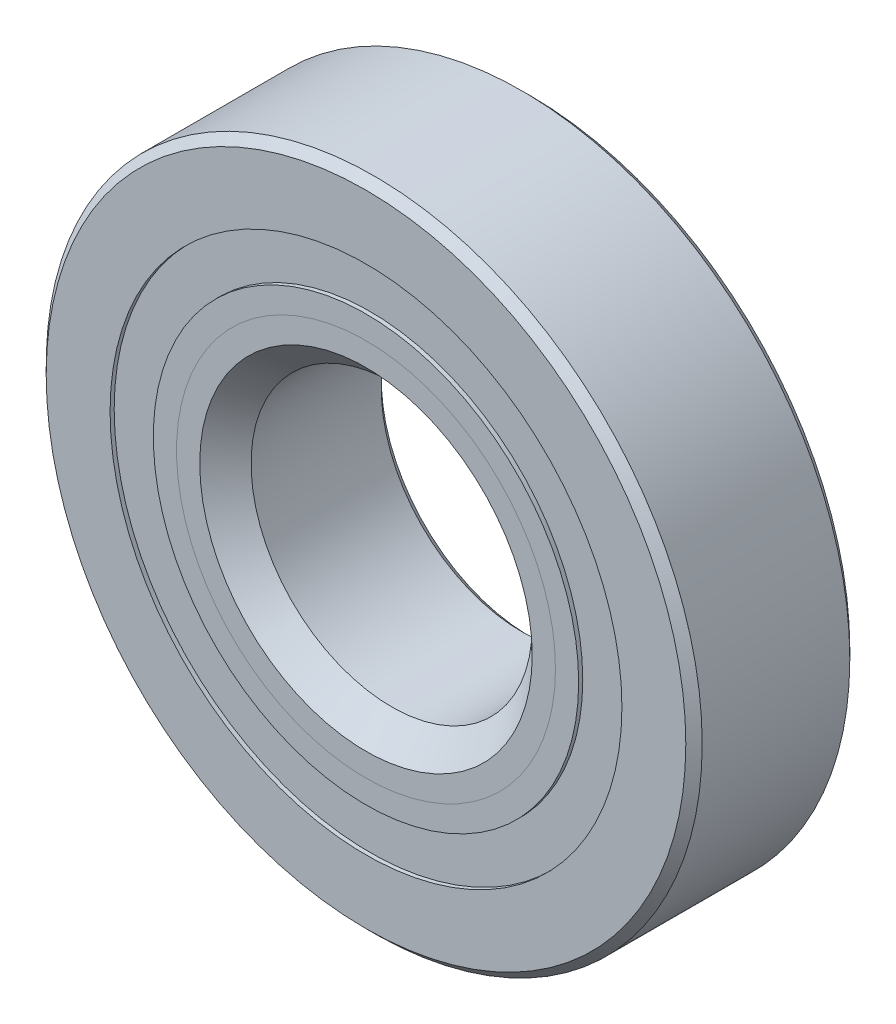
ISO-10303-21;
HEADER;
FILE_DESCRIPTION(('STEP AP214'),'2;1');
FILE_NAME('part.step','',(''),(''),'','','');
FILE_SCHEMA(('AUTOMOTIVE_DESIGN { 1 0 10303 214 1 1 1 1 }'));
ENDSEC;
DATA;
#1=APPLICATION_CONTEXT('core data for automotive mechanical design processes');
#2=APPLICATION_PROTOCOL_DEFINITION('international standard','automotive_design',2000,#1);
#3=PRODUCT_CONTEXT('',#1,'mechanical');
#4=PRODUCT('Part','Part','',(#3));
#5=PRODUCT_RELATED_PRODUCT_CATEGORY('part','',(#4));
#6=PRODUCT_DEFINITION_FORMATION('','',#4);
#7=PRODUCT_DEFINITION_CONTEXT('part definition',#1,'design');
#8=PRODUCT_DEFINITION('design','',#6,#7);
#9=PRODUCT_DEFINITION_SHAPE('','',#8);
#10=(LENGTH_UNIT() NAMED_UNIT(*) SI_UNIT(.MILLI.,.METRE.));
#11=(NAMED_UNIT(*) PLANE_ANGLE_UNIT() SI_UNIT($,.RADIAN.));
#12=(NAMED_UNIT(*) SI_UNIT($,.STERADIAN.) SOLID_ANGLE_UNIT());
#13=UNCERTAINTY_MEASURE_WITH_UNIT(LENGTH_MEASURE(1.E-05),#10,'distance_accuracy_value','');
#14=(GEOMETRIC_REPRESENTATION_CONTEXT(3) GLOBAL_UNCERTAINTY_ASSIGNED_CONTEXT((#13)) GLOBAL_UNIT_ASSIGNED_CONTEXT((#10,
#11,#12)) REPRESENTATION_CONTEXT('',''));
#15=CARTESIAN_POINT('',(0.,0.,0.));
#16=DIRECTION('',(0.,0.,1.));
#17=DIRECTION('',(1.,0.,0.));
#18=AXIS2_PLACEMENT_3D('',#15,#16,#17);
#19=CARTESIAN_POINT('',(0.,8.67019230769231,-1.43574962434292));
#20=DIRECTION('',(0.,0.,-1.));
#21=DIRECTION('',(-1.,0.,0.));
#22=AXIS2_PLACEMENT_3D('',#19,#20,#21);
#23=PLANE('',#22);
#24=CARTESIAN_POINT('',(0.,0.,-1.43574962434292));
#25=DIRECTION('',(0.,0.,1.));
#26=DIRECTION('',(1.,0.,0.));
#27=AXIS2_PLACEMENT_3D('',#24,#25,#26);
#28=CIRCLE('',#27,7.20480769230769);
#29=CARTESIAN_POINT('',(7.20480769230769,0.,-1.43574962434292));
#30=VERTEX_POINT('',#29);
#31=EDGE_CURVE('E11',#30,#30,#28,.T.);
#32=ORIENTED_EDGE('',*,*,#31,.F.);
#33=EDGE_LOOP('',(#32));
#34=FACE_BOUND('',#33,.T.);
#35=CARTESIAN_POINT('',(0.,0.,-1.43574962434292));
#36=DIRECTION('',(0.,0.,1.));
#37=DIRECTION('',(1.,0.,0.));
#38=AXIS2_PLACEMENT_3D('',#35,#36,#37);
#39=CIRCLE('',#38,8.67019230769231);
#40=CARTESIAN_POINT('',(8.67019230769231,0.,-1.43574962434292));
#41=VERTEX_POINT('',#40);
#42=EDGE_CURVE('E60',#41,#41,#39,.T.);
#43=ORIENTED_EDGE('',*,*,#42,.T.);
#44=EDGE_LOOP('',(#43));
#45=FACE_BOUND('',#44,.T.);
#46=ADVANCED_FACE('F46',(#34,#45),#23,.F.);
#47=CARTESIAN_POINT('',(0.,0.,2.77812500000001));
#48=DIRECTION('',(0.,0.,1.));
#49=DIRECTION('',(1.,0.,0.));
#50=AXIS2_PLACEMENT_3D('',#47,#48,#49);
#51=CYLINDRICAL_SURFACE('',#50,7.20480769230769);
#52=CARTESIAN_POINT('',(0.,0.,-2.63921875000001));
#53=DIRECTION('',(0.,0.,1.));
#54=DIRECTION('',(1.,0.,0.));
#55=AXIS2_PLACEMENT_3D('',#52,#53,#54);
#56=CIRCLE('',#55,7.20480769230769);
#57=CARTESIAN_POINT('',(7.20480769230769,0.,-2.63921875000001));
#58=VERTEX_POINT('',#57);
#59=EDGE_CURVE('E52',#58,#58,#56,.T.);
#60=ORIENTED_EDGE('',*,*,#59,.F.);
#61=EDGE_LOOP('',(#60));
#62=FACE_BOUND('',#61,.T.);
#63=ORIENTED_EDGE('',*,*,#31,.T.);
#64=EDGE_LOOP('',(#63));
#65=FACE_BOUND('',#64,.T.);
#66=ADVANCED_FACE('F75',(#62,#65),#51,.F.);
#67=CARTESIAN_POINT('',(0.,8.67019230769231,-2.63921874999999));
#68=DIRECTION('',(0.,0.,1.));
#69=DIRECTION('',(1.,0.,0.));
#70=AXIS2_PLACEMENT_3D('',#67,#68,#69);
#71=PLANE('',#70);
#72=CARTESIAN_POINT('',(0.,0.,-2.63921875000001));
#73=DIRECTION('',(0.,0.,1.));
#74=DIRECTION('',(1.,0.,0.));
#75=AXIS2_PLACEMENT_3D('',#72,#73,#74);
#76=CIRCLE('',#75,8.67019230769231);
#77=CARTESIAN_POINT('',(8.67019230769231,0.,-2.63921875000001));
#78=VERTEX_POINT('',#77);
#79=EDGE_CURVE('E56',#78,#78,#76,.T.);
#80=ORIENTED_EDGE('',*,*,#79,.F.);
#81=EDGE_LOOP('',(#80));
#82=FACE_BOUND('',#81,.T.);
#83=ORIENTED_EDGE('',*,*,#59,.T.);
#84=EDGE_LOOP('',(#83));
#85=FACE_BOUND('',#84,.T.);
#86=ADVANCED_FACE('F70',(#82,#85),#71,.F.);
#87=CARTESIAN_POINT('',(0.,0.,2.77812500000001));
#88=DIRECTION('',(0.,0.,1.));
#89=DIRECTION('',(1.,0.,0.));
#90=AXIS2_PLACEMENT_3D('',#87,#88,#89);
#91=CYLINDRICAL_SURFACE('',#90,8.67019230769231);
#92=ORIENTED_EDGE('',*,*,#42,.F.);
#93=EDGE_LOOP('',(#92));
#94=FACE_BOUND('',#93,.T.);
#95=ORIENTED_EDGE('',*,*,#79,.T.);
#96=EDGE_LOOP('',(#95));
#97=FACE_BOUND('',#96,.T.);
#98=ADVANCED_FACE('F67',(#94,#97),#91,.T.);
#99=CLOSED_SHELL('',(#46,#66,#86,#98));
#100=MANIFOLD_SOLID_BREP('B2',#99);
#101=CARTESIAN_POINT('',(0.,8.67019230769231,2.63921875000001));
#102=DIRECTION('',(0.,0.,-1.));
#103=DIRECTION('',(-1.,0.,0.));
#104=AXIS2_PLACEMENT_3D('',#101,#102,#103);
#105=PLANE('',#104);
#106=CARTESIAN_POINT('',(0.,0.,2.63921875000001));
#107=DIRECTION('',(0.,0.,1.));
#108=DIRECTION('',(1.,0.,0.));
#109=AXIS2_PLACEMENT_3D('',#106,#107,#108);
#110=CIRCLE('',#109,7.20480769230769);
#111=CARTESIAN_POINT('',(7.20480769230769,0.,2.63921875000001));
#112=VERTEX_POINT('',#111);
#113=EDGE_CURVE('E45',#112,#112,#110,.T.);
#114=ORIENTED_EDGE('',*,*,#113,.F.);
#115=EDGE_LOOP('',(#114));
#116=FACE_BOUND('',#115,.T.);
#117=CARTESIAN_POINT('',(0.,0.,2.63921875000001));
#118=DIRECTION('',(0.,0.,1.));
#119=DIRECTION('',(1.,0.,0.));
#120=AXIS2_PLACEMENT_3D('',#117,#118,#119);
#121=CIRCLE('',#120,8.67019230769231);
#122=CARTESIAN_POINT('',(8.67019230769231,0.,2.63921875000001));
#123=VERTEX_POINT('',#122);
#124=EDGE_CURVE('E128',#123,#123,#121,.T.);
#125=ORIENTED_EDGE('',*,*,#124,.T.);
#126=EDGE_LOOP('',(#125));
#127=FACE_BOUND('',#126,.T.);
#128=ADVANCED_FACE('F114',(#116,#127),#105,.F.);
#129=CARTESIAN_POINT('',(0.,0.,2.77812500000001));
#130=DIRECTION('',(0.,0.,1.));
#131=DIRECTION('',(1.,0.,0.));
#132=AXIS2_PLACEMENT_3D('',#129,#130,#131);
#133=CYLINDRICAL_SURFACE('',#132,7.20480769230769);
#134=CARTESIAN_POINT('',(0.,0.,1.43574962434292));
#135=DIRECTION('',(0.,0.,1.));
#136=DIRECTION('',(1.,0.,0.));
#137=AXIS2_PLACEMENT_3D('',#134,#135,#136);
#138=CIRCLE('',#137,7.20480769230769);
#139=CARTESIAN_POINT('',(7.20480769230769,0.,1.43574962434292));
#140=VERTEX_POINT('',#139);
#141=EDGE_CURVE('E120',#140,#140,#138,.T.);
#142=ORIENTED_EDGE('',*,*,#141,.F.);
#143=EDGE_LOOP('',(#142));
#144=FACE_BOUND('',#143,.T.);
#145=ORIENTED_EDGE('',*,*,#113,.T.);
#146=EDGE_LOOP('',(#145));
#147=FACE_BOUND('',#146,.T.);
#148=ADVANCED_FACE('F143',(#144,#147),#133,.F.);
#149=CARTESIAN_POINT('',(0.,8.67019230769231,1.43574962434294));
#150=DIRECTION('',(0.,0.,1.));
#151=DIRECTION('',(1.,0.,0.));
#152=AXIS2_PLACEMENT_3D('',#149,#150,#151);
#153=PLANE('',#152);
#154=CARTESIAN_POINT('',(0.,0.,1.43574962434292));
#155=DIRECTION('',(0.,0.,1.));
#156=DIRECTION('',(1.,0.,0.));
#157=AXIS2_PLACEMENT_3D('',#154,#155,#156);
#158=CIRCLE('',#157,8.67019230769231);
#159=CARTESIAN_POINT('',(8.67019230769231,0.,1.43574962434292));
#160=VERTEX_POINT('',#159);
#161=EDGE_CURVE('E124',#160,#160,#158,.T.);
#162=ORIENTED_EDGE('',*,*,#161,.F.);
#163=EDGE_LOOP('',(#162));
#164=FACE_BOUND('',#163,.T.);
#165=ORIENTED_EDGE('',*,*,#141,.T.);
#166=EDGE_LOOP('',(#165));
#167=FACE_BOUND('',#166,.T.);
#168=ADVANCED_FACE('F138',(#164,#167),#153,.F.);
#169=CARTESIAN_POINT('',(0.,0.,2.77812500000001));
#170=DIRECTION('',(0.,0.,1.));
#171=DIRECTION('',(1.,0.,0.));
#172=AXIS2_PLACEMENT_3D('',#169,#170,#171);
#173=CYLINDRICAL_SURFACE('',#172,8.67019230769231);
#174=ORIENTED_EDGE('',*,*,#124,.F.);
#175=EDGE_LOOP('',(#174));
#176=FACE_BOUND('',#175,.T.);
#177=ORIENTED_EDGE('',*,*,#161,.T.);
#178=EDGE_LOOP('',(#177));
#179=FACE_BOUND('',#178,.T.);
#180=ADVANCED_FACE('F135',(#176,#179),#173,.T.);
#181=CLOSED_SHELL('',(#128,#148,#168,#180));
#182=MANIFOLD_SOLID_BREP('B6',#181);
#183=CARTESIAN_POINT('',(-3.96874999999991,6.87407664253903,0.));
#184=DIRECTION('',(0.,0.,1.));
#185=DIRECTION('',(-0.499999999999989,0.866025403784445,0.));
#186=AXIS2_PLACEMENT_3D('',#183,#184,#185);
#187=SPHERICAL_SURFACE('',#186,1.43574962434293);
#188=CARTESIAN_POINT('',(-3.96874999999991,6.87407664253903,1.43574962434294));
#189=VERTEX_POINT('',#188);
#190=VERTEX_LOOP('',#189);
#191=FACE_BOUND('',#190,.T.);
#192=ADVANCED_FACE('F182',(#191),#187,.T.);
#193=CLOSED_SHELL('',(#192));
#194=MANIFOLD_SOLID_BREP('B40',#193);
#195=CARTESIAN_POINT('',(-6.87407664253894,3.96875000000008,0.));
#196=DIRECTION('',(0.,0.,1.));
#197=DIRECTION('',(-0.866025403784433,0.50000000000001,0.));
#198=AXIS2_PLACEMENT_3D('',#195,#196,#197);
#199=SPHERICAL_SURFACE('',#198,1.43574962434293);
#200=CARTESIAN_POINT('',(-6.87407664253894,3.96875000000008,1.43574962434293));
#201=VERTEX_POINT('',#200);
#202=VERTEX_LOOP('',#201);
#203=FACE_BOUND('',#202,.T.);
#204=ADVANCED_FACE('F214',(#203),#199,.T.);
#205=CLOSED_SHELL('',(#204));
#206=MANIFOLD_SOLID_BREP('B110',#205);
#207=CARTESIAN_POINT('',(-7.9375,0.,0.));
#208=DIRECTION('',(0.,0.,1.));
#209=DIRECTION('',(-1.,0.,0.));
#210=AXIS2_PLACEMENT_3D('',#207,#208,#209);
#211=SPHERICAL_SURFACE('',#210,1.43574962434293);
#212=CARTESIAN_POINT('',(-7.9375,0.,1.43574962434293));
#213=VERTEX_POINT('',#212);
#214=VERTEX_LOOP('',#213);
#215=FACE_BOUND('',#214,.T.);
#216=ADVANCED_FACE('F246',(#215),#211,.T.);
#217=CLOSED_SHELL('',(#216));
#218=MANIFOLD_SOLID_BREP('B178',#217);
#219=CARTESIAN_POINT('',(-6.87407664253901,-3.96874999999993,0.));
#220=DIRECTION('',(0.,0.,1.));
#221=DIRECTION('',(-0.866025403784443,-0.499999999999992,0.));
#222=AXIS2_PLACEMENT_3D('',#219,#220,#221);
#223=SPHERICAL_SURFACE('',#222,1.43574962434293);
#224=CARTESIAN_POINT('',(-6.87407664253901,-3.96874999999993,1.43574962434293));
#225=VERTEX_POINT('',#224);
#226=VERTEX_LOOP('',#225);
#227=FACE_BOUND('',#226,.T.);
#228=ADVANCED_FACE('F278',(#227),#223,.T.);
#229=CLOSED_SHELL('',(#228));
#230=MANIFOLD_SOLID_BREP('B210',#229);
#231=CARTESIAN_POINT('',(-3.96875000000006,-6.87407664253895,0.));
#232=DIRECTION('',(0.,0.,1.));
#233=DIRECTION('',(-0.500000000000007,-0.866025403784435,0.));
#234=AXIS2_PLACEMENT_3D('',#231,#232,#233);
#235=SPHERICAL_SURFACE('',#234,1.43574962434293);
#236=CARTESIAN_POINT('',(-3.96875000000006,-6.87407664253895,1.43574962434293));
#237=VERTEX_POINT('',#236);
#238=VERTEX_LOOP('',#237);
#239=FACE_BOUND('',#238,.T.);
#240=ADVANCED_FACE('F310',(#239),#235,.T.);
#241=CLOSED_SHELL('',(#240));
#242=MANIFOLD_SOLID_BREP('B242',#241);
#243=CARTESIAN_POINT('',(0.,-7.9375,0.));
#244=DIRECTION('',(0.,0.,1.));
#245=DIRECTION('',(0.,-1.,0.));
#246=AXIS2_PLACEMENT_3D('',#243,#244,#245);
#247=SPHERICAL_SURFACE('',#246,1.43574962434293);
#248=CARTESIAN_POINT('',(0.,-7.9375,1.43574962434293));
#249=VERTEX_POINT('',#248);
#250=VERTEX_LOOP('',#249);
#251=FACE_BOUND('',#250,.T.);
#252=ADVANCED_FACE('F342',(#251),#247,.T.);
#253=CLOSED_SHELL('',(#252));
#254=MANIFOLD_SOLID_BREP('B274',#253);
#255=CARTESIAN_POINT('',(3.96874999999996,-6.87407664253901,0.));
#256=DIRECTION('',(0.,0.,1.));
#257=DIRECTION('',(0.499999999999995,-0.866025403784442,0.));
#258=AXIS2_PLACEMENT_3D('',#255,#256,#257);
#259=SPHERICAL_SURFACE('',#258,1.43574962434293);
#260=CARTESIAN_POINT('',(3.96874999999996,-6.87407664253901,1.43574962434293));
#261=VERTEX_POINT('',#260);
#262=VERTEX_LOOP('',#261);
#263=FACE_BOUND('',#262,.T.);
#264=ADVANCED_FACE('F374',(#263),#259,.T.);
#265=CLOSED_SHELL('',(#264));
#266=MANIFOLD_SOLID_BREP('B306',#265);
#267=CARTESIAN_POINT('',(6.87407664253897,-3.96875000000003,0.));
#268=DIRECTION('',(0.,0.,1.));
#269=DIRECTION('',(0.866025403784436,-0.500000000000004,0.));
#270=AXIS2_PLACEMENT_3D('',#267,#268,#269);
#271=SPHERICAL_SURFACE('',#270,1.43574962434293);
#272=CARTESIAN_POINT('',(6.87407664253897,-3.96875000000003,1.43574962434293));
#273=VERTEX_POINT('',#272);
#274=VERTEX_LOOP('',#273);
#275=FACE_BOUND('',#274,.T.);
#276=ADVANCED_FACE('F406',(#275),#271,.T.);
#277=CLOSED_SHELL('',(#276));
#278=MANIFOLD_SOLID_BREP('B338',#277);
#279=CARTESIAN_POINT('',(7.9375,0.,0.));
#280=DIRECTION('',(0.,0.,1.));
#281=DIRECTION('',(1.,0.,0.));
#282=AXIS2_PLACEMENT_3D('',#279,#280,#281);
#283=SPHERICAL_SURFACE('',#282,1.43574962434293);
#284=CARTESIAN_POINT('',(7.9375,0.,1.43574962434293));
#285=VERTEX_POINT('',#284);
#286=VERTEX_LOOP('',#285);
#287=FACE_BOUND('',#286,.T.);
#288=ADVANCED_FACE('F438',(#287),#283,.T.);
#289=CLOSED_SHELL('',(#288));
#290=MANIFOLD_SOLID_BREP('B370',#289);
#291=CARTESIAN_POINT('',(6.87407664253899,3.96874999999999,0.));
#292=DIRECTION('',(0.,0.,1.));
#293=DIRECTION('',(0.86602540378444,0.499999999999998,0.));
#294=AXIS2_PLACEMENT_3D('',#291,#292,#293);
#295=SPHERICAL_SURFACE('',#294,1.43574962434293);
#296=CARTESIAN_POINT('',(6.87407664253899,3.96874999999999,1.43574962434293));
#297=VERTEX_POINT('',#296);
#298=VERTEX_LOOP('',#297);
#299=FACE_BOUND('',#298,.T.);
#300=ADVANCED_FACE('F470',(#299),#295,.T.);
#301=CLOSED_SHELL('',(#300));
#302=MANIFOLD_SOLID_BREP('B402',#301);
#303=CARTESIAN_POINT('',(3.96875000000001,6.87407664253897,0.));
#304=DIRECTION('',(0.,0.,1.));
#305=DIRECTION('',(0.500000000000001,0.866025403784438,0.));
#306=AXIS2_PLACEMENT_3D('',#303,#304,#305);
#307=SPHERICAL_SURFACE('',#306,1.43574962434293);
#308=CARTESIAN_POINT('',(3.96875000000001,6.87407664253897,1.43574962434294));
#309=VERTEX_POINT('',#308);
#310=VERTEX_LOOP('',#309);
#311=FACE_BOUND('',#310,.T.);
#312=ADVANCED_FACE('F502',(#311),#307,.T.);
#313=CLOSED_SHELL('',(#312));
#314=MANIFOLD_SOLID_BREP('B434',#313);
#315=CARTESIAN_POINT('',(0.,7.9375,0.));
#316=DIRECTION('',(0.,0.,1.));
#317=DIRECTION('',(0.,1.,0.));
#318=AXIS2_PLACEMENT_3D('',#315,#316,#317);
#319=SPHERICAL_SURFACE('',#318,1.43574962434293);
#320=CARTESIAN_POINT('',(0.,7.9375,1.43574962434293));
#321=VERTEX_POINT('',#320);
#322=VERTEX_LOOP('',#321);
#323=FACE_BOUND('',#322,.T.);
#324=ADVANCED_FACE('F536',(#323),#319,.T.);
#325=CLOSED_SHELL('',(#324));
#326=MANIFOLD_SOLID_BREP('B466',#325);
#327=CARTESIAN_POINT('',(0.,6.41846644006812,2.77812500000001));
#328=DIRECTION('',(0.,0.,-1.));
#329=DIRECTION('',(-1.,0.,0.));
#330=AXIS2_PLACEMENT_3D('',#327,#328,#329);
#331=PLANE('',#330);
#332=CARTESIAN_POINT('',(0.,0.,2.77812500000001));
#333=DIRECTION('',(0.,0.,1.));
#334=DIRECTION('',(1.,0.,0.));
#335=AXIS2_PLACEMENT_3D('',#332,#333,#334);
#336=CIRCLE('',#335,5.63212518782854);
#337=CARTESIAN_POINT('',(5.63212518782853,0.,2.77812500000001));
#338=VERTEX_POINT('',#337);
#339=EDGE_CURVE('E591',#338,#338,#336,.T.);
#340=ORIENTED_EDGE('',*,*,#339,.F.);
#341=EDGE_LOOP('',(#340));
#342=FACE_BOUND('',#341,.T.);
#343=CARTESIAN_POINT('',(0.,0.,2.77812500000001));
#344=DIRECTION('',(0.,0.,1.));
#345=DIRECTION('',(1.,0.,0.));
#346=AXIS2_PLACEMENT_3D('',#343,#344,#345);
#347=CIRCLE('',#346,6.41846644006811);
#348=CARTESIAN_POINT('',(6.41846644006811,0.,2.77812500000001));
#349=VERTEX_POINT('',#348);
#350=EDGE_CURVE('E535',#349,#349,#347,.T.);
#351=ORIENTED_EDGE('',*,*,#350,.T.);
#352=EDGE_LOOP('',(#351));
#353=FACE_BOUND('',#352,.T.);
#354=ADVANCED_FACE('F557',(#342,#353),#331,.F.);
#355=CARTESIAN_POINT('',(0.,0.,1.99178374776042));
#356=DIRECTION('',(0.,0.,1.));
#357=DIRECTION('',(1.,0.,0.));
#358=AXIS2_PLACEMENT_3D('',#355,#356,#357);
#359=CONICAL_SURFACE('',#358,5.63212518782854,0.78539816339745);
#360=ORIENTED_EDGE('',*,*,#350,.F.);
#361=EDGE_LOOP('',(#360));
#362=FACE_BOUND('',#361,.T.);
#363=CARTESIAN_POINT('',(0.,0.,1.99178374776042));
#364=DIRECTION('',(0.,0.,1.));
#365=DIRECTION('',(1.,0.,0.));
#366=AXIS2_PLACEMENT_3D('',#363,#364,#365);
#367=CIRCLE('',#366,5.63212518782854);
#368=CARTESIAN_POINT('',(5.63212518782854,0.,1.99178374776042));
#369=VERTEX_POINT('',#368);
#370=EDGE_CURVE('E563',#369,#369,#367,.T.);
#371=ORIENTED_EDGE('',*,*,#370,.T.);
#372=EDGE_LOOP('',(#371));
#373=FACE_BOUND('',#372,.T.);
#374=ADVANCED_FACE('F598',(#362,#373),#359,.T.);
#375=CARTESIAN_POINT('',(0.,0.,2.77812500000001));
#376=DIRECTION('',(0.,0.,1.));
#377=DIRECTION('',(1.,0.,0.));
#378=AXIS2_PLACEMENT_3D('',#375,#376,#377);
#379=CYLINDRICAL_SURFACE('',#378,5.63212518782854);
#380=ORIENTED_EDGE('',*,*,#370,.F.);
#381=EDGE_LOOP('',(#380));
#382=FACE_BOUND('',#381,.T.);
#383=CARTESIAN_POINT('',(0.,0.,0.));
#384=DIRECTION('',(0.,0.,1.));
#385=DIRECTION('',(1.,0.,0.));
#386=AXIS2_PLACEMENT_3D('',#383,#384,#385);
#387=CIRCLE('',#386,5.63212518782854);
#388=CARTESIAN_POINT('',(5.63212518782854,0.,0.));
#389=VERTEX_POINT('',#388);
#390=EDGE_CURVE('E567',#389,#389,#387,.T.);
#391=ORIENTED_EDGE('',*,*,#390,.T.);
#392=EDGE_LOOP('',(#391));
#393=FACE_BOUND('',#392,.T.);
#394=ADVANCED_FACE('F602',(#382,#393),#379,.T.);
#395=CARTESIAN_POINT('',(0.,5.63212518782853,0.));
#396=DIRECTION('',(0.,0.,-1.));
#397=DIRECTION('',(-1.,0.,0.));
#398=AXIS2_PLACEMENT_3D('',#395,#396,#397);
#399=PLANE('',#398);
#400=ORIENTED_EDGE('',*,*,#390,.F.);
#401=EDGE_LOOP('',(#400));
#402=FACE_BOUND('',#401,.T.);
#403=CARTESIAN_POINT('',(0.,0.,0.));
#404=DIRECTION('',(0.,0.,1.));
#405=DIRECTION('',(1.,0.,0.));
#406=AXIS2_PLACEMENT_3D('',#403,#404,#405);
#407=CIRCLE('',#406,6.50175037565707);
#408=CARTESIAN_POINT('',(6.50175037565707,0.,0.));
#409=VERTEX_POINT('',#408);
#410=EDGE_CURVE('E571',#409,#409,#407,.T.);
#411=ORIENTED_EDGE('',*,*,#410,.T.);
#412=EDGE_LOOP('',(#411));
#413=FACE_BOUND('',#412,.T.);
#414=ADVANCED_FACE('F607',(#402,#413),#399,.F.);
#415=CARTESIAN_POINT('',(0.,0.,0.));
#416=DIRECTION('',(0.,0.,1.));
#417=DIRECTION('',(1.,0.,0.));
#418=AXIS2_PLACEMENT_3D('',#415,#416,#417);
#419=TOROIDAL_SURFACE('',#418,7.9375,1.43574962434293);
#420=ORIENTED_EDGE('',*,*,#410,.F.);
#421=EDGE_LOOP('',(#420));
#422=FACE_BOUND('',#421,.T.);
#423=CARTESIAN_POINT('',(0.,0.,-1.23472222222222));
#424=DIRECTION('',(0.,0.,1.));
#425=DIRECTION('',(1.,0.,0.));
#426=AXIS2_PLACEMENT_3D('',#423,#424,#425);
#427=CIRCLE('',#426,7.20480769230769);
#428=CARTESIAN_POINT('',(7.20480769230769,0.,-1.23472222222222));
#429=VERTEX_POINT('',#428);
#430=EDGE_CURVE('E576',#429,#429,#427,.T.);
#431=ORIENTED_EDGE('',*,*,#430,.T.);
#432=EDGE_LOOP('',(#431));
#433=FACE_BOUND('',#432,.T.);
#434=ADVANCED_FACE('F613',(#422,#433),#419,.F.);
#435=CARTESIAN_POINT('',(0.,0.,2.77812500000001));
#436=DIRECTION('',(0.,0.,1.));
#437=DIRECTION('',(1.,0.,0.));
#438=AXIS2_PLACEMENT_3D('',#435,#436,#437);
#439=CYLINDRICAL_SURFACE('',#438,7.20480769230769);
#440=ORIENTED_EDGE('',*,*,#430,.F.);
#441=EDGE_LOOP('',(#440));
#442=FACE_BOUND('',#441,.T.);
#443=CARTESIAN_POINT('',(0.,0.,-2.77812500000001));
#444=DIRECTION('',(0.,0.,1.));
#445=DIRECTION('',(1.,0.,0.));
#446=AXIS2_PLACEMENT_3D('',#443,#444,#445);
#447=CIRCLE('',#446,7.20480769230769);
#448=CARTESIAN_POINT('',(7.20480769230769,0.,-2.77812500000001));
#449=VERTEX_POINT('',#448);
#450=EDGE_CURVE('E579',#449,#449,#447,.T.);
#451=ORIENTED_EDGE('',*,*,#450,.T.);
#452=EDGE_LOOP('',(#451));
#453=FACE_BOUND('',#452,.T.);
#454=ADVANCED_FACE('F617',(#442,#453),#439,.T.);
#455=CARTESIAN_POINT('',(0.,5.04031249999999,-2.77812499999999));
#456=DIRECTION('',(0.,0.,1.));
#457=DIRECTION('',(1.,0.,0.));
#458=AXIS2_PLACEMENT_3D('',#455,#456,#457);
#459=PLANE('',#458);
#460=ORIENTED_EDGE('',*,*,#450,.F.);
#461=EDGE_LOOP('',(#460));
#462=FACE_BOUND('',#461,.T.);
#463=CARTESIAN_POINT('',(0.,0.,-2.77812500000001));
#464=DIRECTION('',(0.,0.,1.));
#465=DIRECTION('',(1.,0.,0.));
#466=AXIS2_PLACEMENT_3D('',#463,#464,#465);
#467=CIRCLE('',#466,5.0403125);
#468=CARTESIAN_POINT('',(5.0403125,0.,-2.77812500000001));
#469=VERTEX_POINT('',#468);
#470=EDGE_CURVE('E582',#469,#469,#467,.T.);
#471=ORIENTED_EDGE('',*,*,#470,.T.);
#472=EDGE_LOOP('',(#471));
#473=FACE_BOUND('',#472,.T.);
#474=ADVANCED_FACE('F621',(#462,#473),#459,.F.);
#475=CARTESIAN_POINT('',(0.,0.,-2.5003125));
#476=DIRECTION('',(0.,0.,-1.));
#477=DIRECTION('',(-1.,0.,0.));
#478=AXIS2_PLACEMENT_3D('',#475,#476,#477);
#479=CONICAL_SURFACE('',#478,4.7625,0.785398163397445);
#480=ORIENTED_EDGE('',*,*,#470,.F.);
#481=EDGE_LOOP('',(#480));
#482=FACE_BOUND('',#481,.T.);
#483=CARTESIAN_POINT('',(0.,0.,-2.5003125));
#484=DIRECTION('',(0.,0.,1.));
#485=DIRECTION('',(1.,0.,0.));
#486=AXIS2_PLACEMENT_3D('',#483,#484,#485);
#487=CIRCLE('',#486,4.7625);
#488=CARTESIAN_POINT('',(4.7625,0.,-2.5003125));
#489=VERTEX_POINT('',#488);
#490=EDGE_CURVE('E585',#489,#489,#487,.T.);
#491=ORIENTED_EDGE('',*,*,#490,.T.);
#492=EDGE_LOOP('',(#491));
#493=FACE_BOUND('',#492,.T.);
#494=ADVANCED_FACE('F625',(#482,#493),#479,.F.);
#495=CARTESIAN_POINT('',(0.,0.,2.77812500000001));
#496=DIRECTION('',(0.,0.,1.));
#497=DIRECTION('',(1.,0.,0.));
#498=AXIS2_PLACEMENT_3D('',#495,#496,#497);
#499=CYLINDRICAL_SURFACE('',#498,4.7625);
#500=ORIENTED_EDGE('',*,*,#490,.F.);
#501=EDGE_LOOP('',(#500));
#502=FACE_BOUND('',#501,.T.);
#503=CARTESIAN_POINT('',(0.,0.,1.90849981217146));
#504=DIRECTION('',(0.,0.,1.));
#505=DIRECTION('',(1.,0.,0.));
#506=AXIS2_PLACEMENT_3D('',#503,#504,#505);
#507=CIRCLE('',#506,4.7625);
#508=CARTESIAN_POINT('',(4.7625,0.,1.90849981217146));
#509=VERTEX_POINT('',#508);
#510=EDGE_CURVE('E588',#509,#509,#507,.T.);
#511=ORIENTED_EDGE('',*,*,#510,.T.);
#512=EDGE_LOOP('',(#511));
#513=FACE_BOUND('',#512,.T.);
#514=ADVANCED_FACE('F629',(#502,#513),#499,.F.);
#515=CARTESIAN_POINT('',(0.,0.,2.77812500000001));
#516=DIRECTION('',(0.,0.,1.));
#517=DIRECTION('',(1.,0.,0.));
#518=AXIS2_PLACEMENT_3D('',#515,#516,#517);
#519=CONICAL_SURFACE('',#518,5.63212518782854,0.78539816339745);
#520=ORIENTED_EDGE('',*,*,#510,.F.);
#521=EDGE_LOOP('',(#520));
#522=FACE_BOUND('',#521,.T.);
#523=ORIENTED_EDGE('',*,*,#339,.T.);
#524=EDGE_LOOP('',(#523));
#525=FACE_BOUND('',#524,.T.);
#526=ADVANCED_FACE('F595',(#522,#525),#519,.F.);
#527=CLOSED_SHELL('',(#354,#374,#394,#414,#434,#454,#474,#494,#514,#526));
#528=MANIFOLD_SOLID_BREP('B498',#527);
#529=CARTESIAN_POINT('',(0.,7.20480769230769,2.77812500000001));
#530=DIRECTION('',(0.,0.,-1.));
#531=DIRECTION('',(-1.,0.,0.));
#532=AXIS2_PLACEMENT_3D('',#529,#530,#531);
#533=PLANE('',#532);
#534=CARTESIAN_POINT('',(0.,0.,2.77812500000001));
#535=DIRECTION('',(0.,0.,1.));
#536=DIRECTION('',(1.,0.,0.));
#537=AXIS2_PLACEMENT_3D('',#534,#535,#536);
#538=CIRCLE('',#537,6.41846644006811);
#539=CARTESIAN_POINT('',(6.41846644006811,0.,2.77812500000001));
#540=VERTEX_POINT('',#539);
#541=EDGE_CURVE('E556',#540,#540,#538,.T.);
#542=ORIENTED_EDGE('',*,*,#541,.F.);
#543=EDGE_LOOP('',(#542));
#544=FACE_BOUND('',#543,.T.);
#545=CARTESIAN_POINT('',(0.,0.,2.77812500000001));
#546=DIRECTION('',(0.,0.,1.));
#547=DIRECTION('',(1.,0.,0.));
#548=AXIS2_PLACEMENT_3D('',#545,#546,#547);
#549=CIRCLE('',#548,7.20480769230769);
#550=CARTESIAN_POINT('',(7.20480769230769,0.,2.77812500000001));
#551=VERTEX_POINT('',#550);
#552=EDGE_CURVE('E738',#551,#551,#549,.T.);
#553=ORIENTED_EDGE('',*,*,#552,.T.);
#554=EDGE_LOOP('',(#553));
#555=FACE_BOUND('',#554,.T.);
#556=ADVANCED_FACE('F716',(#544,#555),#533,.F.);
#557=CARTESIAN_POINT('',(0.,0.,2.77812500000001));
#558=DIRECTION('',(0.,0.,1.));
#559=DIRECTION('',(1.,0.,0.));
#560=AXIS2_PLACEMENT_3D('',#557,#558,#559);
#561=CONICAL_SURFACE('',#560,6.41846644006811,0.78539816339745);
#562=CARTESIAN_POINT('',(0.,0.,1.99178374776042));
#563=DIRECTION('',(0.,0.,1.));
#564=DIRECTION('',(1.,0.,0.));
#565=AXIS2_PLACEMENT_3D('',#562,#563,#564);
#566=CIRCLE('',#565,5.63212518782854);
#567=CARTESIAN_POINT('',(5.63212518782854,0.,1.99178374776042));
#568=VERTEX_POINT('',#567);
#569=EDGE_CURVE('E722',#568,#568,#566,.T.);
#570=ORIENTED_EDGE('',*,*,#569,.F.);
#571=EDGE_LOOP('',(#570));
#572=FACE_BOUND('',#571,.T.);
#573=ORIENTED_EDGE('',*,*,#541,.T.);
#574=EDGE_LOOP('',(#573));
#575=FACE_BOUND('',#574,.T.);
#576=ADVANCED_FACE('F763',(#572,#575),#561,.F.);
#577=CARTESIAN_POINT('',(0.,0.,2.77812500000001));
#578=DIRECTION('',(0.,0.,1.));
#579=DIRECTION('',(1.,0.,0.));
#580=AXIS2_PLACEMENT_3D('',#577,#578,#579);
#581=CYLINDRICAL_SURFACE('',#580,5.63212518782854);
#582=CARTESIAN_POINT('',(0.,0.,0.));
#583=DIRECTION('',(0.,0.,1.));
#584=DIRECTION('',(1.,0.,0.));
#585=AXIS2_PLACEMENT_3D('',#582,#583,#584);
#586=CIRCLE('',#585,5.63212518782854);
#587=CARTESIAN_POINT('',(5.63212518782854,0.,0.));
#588=VERTEX_POINT('',#587);
#589=EDGE_CURVE('E726',#588,#588,#586,.T.);
#590=ORIENTED_EDGE('',*,*,#589,.F.);
#591=EDGE_LOOP('',(#590));
#592=FACE_BOUND('',#591,.T.);
#593=ORIENTED_EDGE('',*,*,#569,.T.);
#594=EDGE_LOOP('',(#593));
#595=FACE_BOUND('',#594,.T.);
#596=ADVANCED_FACE('F758',(#592,#595),#581,.F.);
#597=CARTESIAN_POINT('',(0.,5.63212518782853,0.));
#598=DIRECTION('',(0.,0.,1.));
#599=DIRECTION('',(1.,0.,0.));
#600=AXIS2_PLACEMENT_3D('',#597,#598,#599);
#601=PLANE('',#600);
#602=CARTESIAN_POINT('',(0.,0.,0.));
#603=DIRECTION('',(0.,0.,1.));
#604=DIRECTION('',(1.,0.,0.));
#605=AXIS2_PLACEMENT_3D('',#602,#603,#604);
#606=CIRCLE('',#605,6.50175037565707);
#607=CARTESIAN_POINT('',(6.50175037565707,0.,0.));
#608=VERTEX_POINT('',#607);
#609=EDGE_CURVE('E730',#608,#608,#606,.T.);
#610=ORIENTED_EDGE('',*,*,#609,.F.);
#611=EDGE_LOOP('',(#610));
#612=FACE_BOUND('',#611,.T.);
#613=ORIENTED_EDGE('',*,*,#589,.T.);
#614=EDGE_LOOP('',(#613));
#615=FACE_BOUND('',#614,.T.);
#616=ADVANCED_FACE('F752',(#612,#615),#601,.F.);
#617=CARTESIAN_POINT('',(0.,0.,0.));
#618=DIRECTION('',(0.,0.,1.));
#619=DIRECTION('',(1.,0.,0.));
#620=AXIS2_PLACEMENT_3D('',#617,#618,#619);
#621=TOROIDAL_SURFACE('',#620,7.9375,1.43574962434293);
#622=CARTESIAN_POINT('',(0.,0.,1.23472222222222));
#623=DIRECTION('',(0.,0.,1.));
#624=DIRECTION('',(1.,0.,0.));
#625=AXIS2_PLACEMENT_3D('',#622,#623,#624);
#626=CIRCLE('',#625,7.20480769230769);
#627=CARTESIAN_POINT('',(7.20480769230769,0.,1.23472222222222));
#628=VERTEX_POINT('',#627);
#629=EDGE_CURVE('E735',#628,#628,#626,.T.);
#630=ORIENTED_EDGE('',*,*,#629,.F.);
#631=EDGE_LOOP('',(#630));
#632=FACE_BOUND('',#631,.T.);
#633=ORIENTED_EDGE('',*,*,#609,.T.);
#634=EDGE_LOOP('',(#633));
#635=FACE_BOUND('',#634,.T.);
#636=ADVANCED_FACE('F746',(#632,#635),#621,.F.);
#637=CARTESIAN_POINT('',(0.,0.,2.77812500000001));
#638=DIRECTION('',(0.,0.,1.));
#639=DIRECTION('',(1.,0.,0.));
#640=AXIS2_PLACEMENT_3D('',#637,#638,#639);
#641=CYLINDRICAL_SURFACE('',#640,7.20480769230769);
#642=ORIENTED_EDGE('',*,*,#552,.F.);
#643=EDGE_LOOP('',(#642));
#644=FACE_BOUND('',#643,.T.);
#645=ORIENTED_EDGE('',*,*,#629,.T.);
#646=EDGE_LOOP('',(#645));
#647=FACE_BOUND('',#646,.T.);
#648=ADVANCED_FACE('F743',(#644,#647),#641,.T.);
#649=CLOSED_SHELL('',(#556,#576,#596,#616,#636,#648));
#650=MANIFOLD_SOLID_BREP('B530',#649);
#651=CARTESIAN_POINT('',(0.,0.,2.5003125));
#652=DIRECTION('',(0.,0.,-1.));
#653=DIRECTION('',(-1.,0.,0.));
#654=AXIS2_PLACEMENT_3D('',#651,#652,#653);
#655=CONICAL_SURFACE('',#654,11.1125,0.785398163397446);
#656=CARTESIAN_POINT('',(0.,0.,2.77812500000001));
#657=DIRECTION('',(0.,0.,1.));
#658=DIRECTION('',(1.,0.,0.));
#659=AXIS2_PLACEMENT_3D('',#656,#657,#658);
#660=CIRCLE('',#659,10.8346875);
#661=CARTESIAN_POINT('',(10.8346875,0.,2.77812500000001));
#662=VERTEX_POINT('',#661);
#663=EDGE_CURVE('E836',#662,#662,#660,.T.);
#664=ORIENTED_EDGE('',*,*,#663,.F.);
#665=EDGE_LOOP('',(#664));
#666=FACE_BOUND('',#665,.T.);
#667=CARTESIAN_POINT('',(0.,0.,2.5003125));
#668=DIRECTION('',(0.,0.,1.));
#669=DIRECTION('',(1.,0.,0.));
#670=AXIS2_PLACEMENT_3D('',#667,#668,#669);
#671=CIRCLE('',#670,11.1125);
#672=CARTESIAN_POINT('',(11.1125,0.,2.5003125));
#673=VERTEX_POINT('',#672);
#674=EDGE_CURVE('E715',#673,#673,#671,.T.);
#675=ORIENTED_EDGE('',*,*,#674,.T.);
#676=EDGE_LOOP('',(#675));
#677=FACE_BOUND('',#676,.T.);
#678=ADVANCED_FACE('F808',(#666,#677),#655,.T.);
#679=CARTESIAN_POINT('',(0.,0.,2.77812500000001));
#680=DIRECTION('',(0.,0.,1.));
#681=DIRECTION('',(1.,0.,0.));
#682=AXIS2_PLACEMENT_3D('',#679,#680,#681);
#683=CYLINDRICAL_SURFACE('',#682,11.1125);
#684=ORIENTED_EDGE('',*,*,#674,.F.);
#685=EDGE_LOOP('',(#684));
#686=FACE_BOUND('',#685,.T.);
#687=CARTESIAN_POINT('',(0.,0.,-2.5003125));
#688=DIRECTION('',(0.,0.,1.));
#689=DIRECTION('',(1.,0.,0.));
#690=AXIS2_PLACEMENT_3D('',#687,#688,#689);
#691=CIRCLE('',#690,11.1125);
#692=CARTESIAN_POINT('',(11.1125,0.,-2.5003125));
#693=VERTEX_POINT('',#692);
#694=EDGE_CURVE('E814',#693,#693,#691,.T.);
#695=ORIENTED_EDGE('',*,*,#694,.T.);
#696=EDGE_LOOP('',(#695));
#697=FACE_BOUND('',#696,.T.);
#698=ADVANCED_FACE('F843',(#686,#697),#683,.T.);
#699=CARTESIAN_POINT('',(0.,0.,-2.77812500000001));
#700=DIRECTION('',(0.,0.,1.));
#701=DIRECTION('',(1.,0.,0.));
#702=AXIS2_PLACEMENT_3D('',#699,#700,#701);
#703=CONICAL_SURFACE('',#702,10.8346875,0.785398163397445);
#704=ORIENTED_EDGE('',*,*,#694,.F.);
#705=EDGE_LOOP('',(#704));
#706=FACE_BOUND('',#705,.T.);
#707=CARTESIAN_POINT('',(0.,0.,-2.77812500000001));
#708=DIRECTION('',(0.,0.,1.));
#709=DIRECTION('',(1.,0.,0.));
#710=AXIS2_PLACEMENT_3D('',#707,#708,#709);
#711=CIRCLE('',#710,10.8346875);
#712=CARTESIAN_POINT('',(10.8346875,0.,-2.77812500000001));
#713=VERTEX_POINT('',#712);
#714=EDGE_CURVE('E818',#713,#713,#711,.T.);
#715=ORIENTED_EDGE('',*,*,#714,.T.);
#716=EDGE_LOOP('',(#715));
#717=FACE_BOUND('',#716,.T.);
#718=ADVANCED_FACE('F847',(#706,#717),#703,.T.);
#719=CARTESIAN_POINT('',(0.,10.8346875,-2.77812499999999));
#720=DIRECTION('',(0.,0.,1.));
#721=DIRECTION('',(1.,0.,0.));
#722=AXIS2_PLACEMENT_3D('',#719,#720,#721);
#723=PLANE('',#722);
#724=ORIENTED_EDGE('',*,*,#714,.F.);
#725=EDGE_LOOP('',(#724));
#726=FACE_BOUND('',#725,.T.);
#727=CARTESIAN_POINT('',(0.,0.,-2.77812500000001));
#728=DIRECTION('',(0.,0.,1.));
#729=DIRECTION('',(1.,0.,0.));
#730=AXIS2_PLACEMENT_3D('',#727,#728,#729);
#731=CIRCLE('',#730,8.67019230769231);
#732=CARTESIAN_POINT('',(8.67019230769231,0.,-2.77812500000001));
#733=VERTEX_POINT('',#732);
#734=EDGE_CURVE('E822',#733,#733,#731,.T.);
#735=ORIENTED_EDGE('',*,*,#734,.T.);
#736=EDGE_LOOP('',(#735));
#737=FACE_BOUND('',#736,.T.);
#738=ADVANCED_FACE('F852',(#726,#737),#723,.F.);
#739=CARTESIAN_POINT('',(0.,0.,2.77812500000001));
#740=DIRECTION('',(0.,0.,1.));
#741=DIRECTION('',(1.,0.,0.));
#742=AXIS2_PLACEMENT_3D('',#739,#740,#741);
#743=CYLINDRICAL_SURFACE('',#742,8.67019230769231);
#744=ORIENTED_EDGE('',*,*,#734,.F.);
#745=EDGE_LOOP('',(#744));
#746=FACE_BOUND('',#745,.T.);
#747=CARTESIAN_POINT('',(0.,0.,-1.23472222222222));
#748=DIRECTION('',(0.,0.,1.));
#749=DIRECTION('',(1.,0.,0.));
#750=AXIS2_PLACEMENT_3D('',#747,#748,#749);
#751=CIRCLE('',#750,8.67019230769231);
#752=CARTESIAN_POINT('',(8.67019230769231,0.,-1.23472222222222));
#753=VERTEX_POINT('',#752);
#754=EDGE_CURVE('E827',#753,#753,#751,.T.);
#755=ORIENTED_EDGE('',*,*,#754,.T.);
#756=EDGE_LOOP('',(#755));
#757=FACE_BOUND('',#756,.T.);
#758=ADVANCED_FACE('F858',(#746,#757),#743,.F.);
#759=CARTESIAN_POINT('',(0.,0.,0.));
#760=DIRECTION('',(0.,0.,1.));
#761=DIRECTION('',(1.,0.,0.));
#762=AXIS2_PLACEMENT_3D('',#759,#760,#761);
#763=TOROIDAL_SURFACE('',#762,7.9375,1.43574962434293);
#764=ORIENTED_EDGE('',*,*,#754,.F.);
#765=EDGE_LOOP('',(#764));
#766=FACE_BOUND('',#765,.T.);
#767=CARTESIAN_POINT('',(0.,0.,1.23472222222222));
#768=DIRECTION('',(0.,0.,1.));
#769=DIRECTION('',(1.,0.,0.));
#770=AXIS2_PLACEMENT_3D('',#767,#768,#769);
#771=CIRCLE('',#770,8.67019230769231);
#772=CARTESIAN_POINT('',(8.67019230769231,0.,1.23472222222222));
#773=VERTEX_POINT('',#772);
#774=EDGE_CURVE('E830',#773,#773,#771,.T.);
#775=ORIENTED_EDGE('',*,*,#774,.T.);
#776=EDGE_LOOP('',(#775));
#777=FACE_BOUND('',#776,.T.);
#778=ADVANCED_FACE('F862',(#766,#777),#763,.F.);
#779=CARTESIAN_POINT('',(0.,0.,2.77812500000001));
#780=DIRECTION('',(0.,0.,1.));
#781=DIRECTION('',(1.,0.,0.));
#782=AXIS2_PLACEMENT_3D('',#779,#780,#781);
#783=CYLINDRICAL_SURFACE('',#782,8.67019230769231);
#784=ORIENTED_EDGE('',*,*,#774,.F.);
#785=EDGE_LOOP('',(#784));
#786=FACE_BOUND('',#785,.T.);
#787=CARTESIAN_POINT('',(0.,0.,2.77812500000001));
#788=DIRECTION('',(0.,0.,1.));
#789=DIRECTION('',(1.,0.,0.));
#790=AXIS2_PLACEMENT_3D('',#787,#788,#789);
#791=CIRCLE('',#790,8.67019230769231);
#792=CARTESIAN_POINT('',(8.6701923076923,0.,2.77812500000001));
#793=VERTEX_POINT('',#792);
#794=EDGE_CURVE('E833',#793,#793,#791,.T.);
#795=ORIENTED_EDGE('',*,*,#794,.T.);
#796=EDGE_LOOP('',(#795));
#797=FACE_BOUND('',#796,.T.);
#798=ADVANCED_FACE('F866',(#786,#797),#783,.F.);
#799=CARTESIAN_POINT('',(0.,10.8346875,2.77812500000001));
#800=DIRECTION('',(0.,0.,-1.));
#801=DIRECTION('',(-1.,0.,0.));
#802=AXIS2_PLACEMENT_3D('',#799,#800,#801);
#803=PLANE('',#802);
#804=ORIENTED_EDGE('',*,*,#794,.F.);
#805=EDGE_LOOP('',(#804));
#806=FACE_BOUND('',#805,.T.);
#807=ORIENTED_EDGE('',*,*,#663,.T.);
#808=EDGE_LOOP('',(#807));
#809=FACE_BOUND('',#808,.T.);
#810=ADVANCED_FACE('F840',(#806,#809),#803,.F.);
#811=CLOSED_SHELL('',(#678,#698,#718,#738,#758,#778,#798,#810));
#812=MANIFOLD_SOLID_BREP('B551',#811);
#813=ADVANCED_BREP_SHAPE_REPRESENTATION('',(#18,#100,#182,#194,#206,#218,#230,#242,#254,#266,
#278,#290,#302,#314,#326,#528,#650,#812),#14);
#814=SHAPE_DEFINITION_REPRESENTATION(#9,#813);
ENDSEC;
END-ISO-10303-21;
